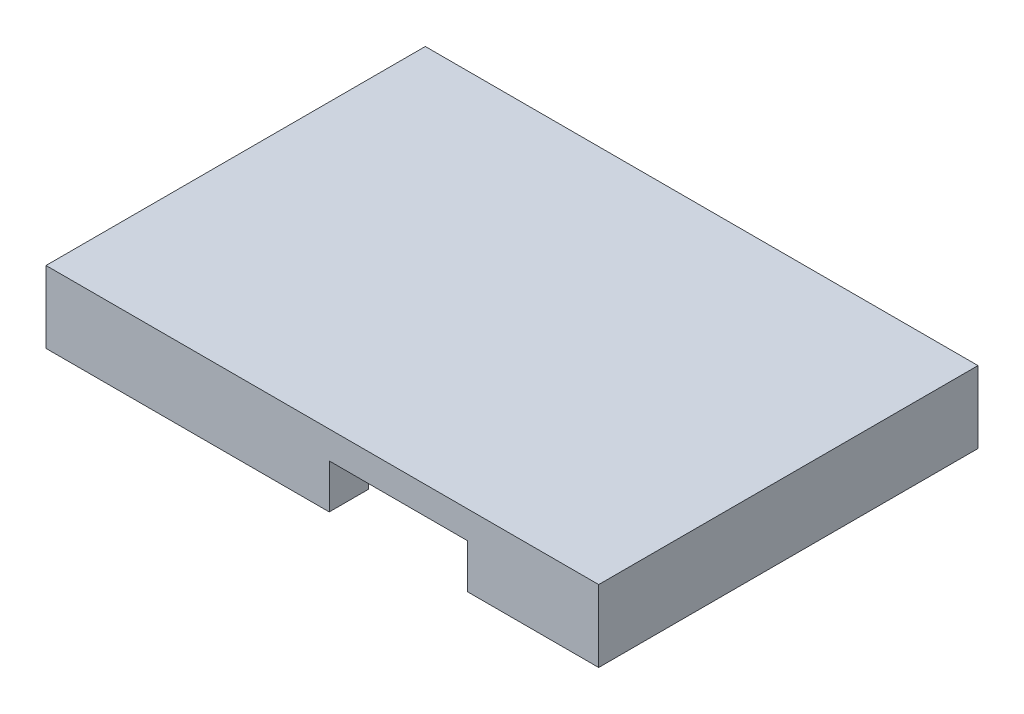
ISO-10303-21;
HEADER;
FILE_DESCRIPTION(('STEP AP214'),'2;1');
FILE_NAME('part.step','',(''),(''),'','','');
FILE_SCHEMA(('AUTOMOTIVE_DESIGN { 1 0 10303 214 1 1 1 1 }'));
ENDSEC;
DATA;
#1=APPLICATION_CONTEXT('core data for automotive mechanical design processes');
#2=APPLICATION_PROTOCOL_DEFINITION('international standard','automotive_design',2000,#1);
#3=PRODUCT_CONTEXT('',#1,'mechanical');
#4=PRODUCT('Part','Part','',(#3));
#5=PRODUCT_RELATED_PRODUCT_CATEGORY('part','',(#4));
#6=PRODUCT_DEFINITION_FORMATION('','',#4);
#7=PRODUCT_DEFINITION_CONTEXT('part definition',#1,'design');
#8=PRODUCT_DEFINITION('design','',#6,#7);
#9=PRODUCT_DEFINITION_SHAPE('','',#8);
#10=(LENGTH_UNIT() NAMED_UNIT(*) SI_UNIT(.MILLI.,.METRE.));
#11=(NAMED_UNIT(*) PLANE_ANGLE_UNIT() SI_UNIT($,.RADIAN.));
#12=(NAMED_UNIT(*) SI_UNIT($,.STERADIAN.) SOLID_ANGLE_UNIT());
#13=UNCERTAINTY_MEASURE_WITH_UNIT(LENGTH_MEASURE(1.E-05),#10,'distance_accuracy_value','');
#14=(GEOMETRIC_REPRESENTATION_CONTEXT(3) GLOBAL_UNCERTAINTY_ASSIGNED_CONTEXT((#13)) GLOBAL_UNIT_ASSIGNED_CONTEXT((#10,
#11,#12)) REPRESENTATION_CONTEXT('',''));
#15=CARTESIAN_POINT('',(0.,0.,0.));
#16=DIRECTION('',(0.,0.,1.));
#17=DIRECTION('',(1.,0.,0.));
#18=AXIS2_PLACEMENT_3D('',#15,#16,#17);
#19=CARTESIAN_POINT('',(11.5,3.2,10.8730401545976));
#20=DIRECTION('',(0.,0.,1.));
#21=DIRECTION('',(1.,0.,0.));
#22=AXIS2_PLACEMENT_3D('',#19,#20,#21);
#23=PLANE('',#22);
#24=DIRECTION('',(-1.,0.,0.));
#25=VECTOR('',#24,1.);
#26=CARTESIAN_POINT('',(11.5,0.,10.8730401545976));
#27=LINE('',#26,#25);
#28=CARTESIAN_POINT('',(11.5,0.,10.8730401545976));
#29=VERTEX_POINT('',#28);
#30=CARTESIAN_POINT('',(10.5,0.,10.8730401545976));
#31=VERTEX_POINT('',#30);
#32=EDGE_CURVE('E250',#29,#31,#27,.T.);
#33=ORIENTED_EDGE('',*,*,#32,.T.);
#34=DIRECTION('',(0.,-1.,0.));
#35=VECTOR('',#34,1.);
#36=CARTESIAN_POINT('',(10.5,3.2,10.8730401545976));
#37=LINE('',#36,#35);
#38=CARTESIAN_POINT('',(10.5,3.2,10.8730401545976));
#39=VERTEX_POINT('',#38);
#40=EDGE_CURVE('E12',#39,#31,#37,.T.);
#41=ORIENTED_EDGE('',*,*,#40,.F.);
#42=DIRECTION('',(-1.,0.,0.));
#43=VECTOR('',#42,1.);
#44=CARTESIAN_POINT('',(11.5,3.2,10.8730401545976));
#45=LINE('',#44,#43);
#46=CARTESIAN_POINT('',(11.5,3.2,10.8730401545976));
#47=VERTEX_POINT('',#46);
#48=EDGE_CURVE('E286',#47,#39,#45,.T.);
#49=ORIENTED_EDGE('',*,*,#48,.F.);
#50=DIRECTION('',(0.,-1.,0.));
#51=VECTOR('',#50,1.);
#52=CARTESIAN_POINT('',(11.5,3.2,10.8730401545976));
#53=LINE('',#52,#51);
#54=EDGE_CURVE('E246',#47,#29,#53,.T.);
#55=ORIENTED_EDGE('',*,*,#54,.T.);
#56=EDGE_LOOP('',(#33,#41,#49,#55));
#57=FACE_BOUND('',#56,.T.);
#58=ADVANCED_FACE('F76',(#57),#23,.F.);
#59=CARTESIAN_POINT('',(10.5,3.2,10.8730401545976));
#60=DIRECTION('',(1.,0.,0.));
#61=DIRECTION('',(0.,0.,-1.));
#62=AXIS2_PLACEMENT_3D('',#59,#60,#61);
#63=PLANE('',#62);
#64=DIRECTION('',(0.,0.,1.));
#65=VECTOR('',#64,1.);
#66=CARTESIAN_POINT('',(10.5,0.,10.8730401545976));
#67=LINE('',#66,#65);
#68=CARTESIAN_POINT('',(10.5,0.,13.7258729261331));
#69=VERTEX_POINT('',#68);
#70=EDGE_CURVE('E253',#31,#69,#67,.T.);
#71=ORIENTED_EDGE('',*,*,#70,.T.);
#72=DIRECTION('',(0.,-1.,0.));
#73=VECTOR('',#72,1.);
#74=CARTESIAN_POINT('',(10.5,3.2,13.7258729261331));
#75=LINE('',#74,#73);
#76=CARTESIAN_POINT('',(10.5,3.2,13.7258729261331));
#77=VERTEX_POINT('',#76);
#78=EDGE_CURVE('E87',#77,#69,#75,.T.);
#79=ORIENTED_EDGE('',*,*,#78,.F.);
#80=DIRECTION('',(0.,0.,1.));
#81=VECTOR('',#80,1.);
#82=CARTESIAN_POINT('',(10.5,3.2,10.8730401545976));
#83=LINE('',#82,#81);
#84=EDGE_CURVE('E174',#39,#77,#83,.T.);
#85=ORIENTED_EDGE('',*,*,#84,.F.);
#86=ORIENTED_EDGE('',*,*,#40,.T.);
#87=EDGE_LOOP('',(#71,#79,#85,#86));
#88=FACE_BOUND('',#87,.T.);
#89=ADVANCED_FACE('F401',(#88),#63,.F.);
#90=CARTESIAN_POINT('',(20.,3.2,13.7258729261331));
#91=DIRECTION('',(-1.,0.,0.));
#92=DIRECTION('',(0.,0.,1.));
#93=AXIS2_PLACEMENT_3D('',#90,#91,#92);
#94=PLANE('',#93);
#95=DIRECTION('',(0.,0.,-1.));
#96=VECTOR('',#95,1.);
#97=CARTESIAN_POINT('',(20.,0.,13.7258729261331));
#98=LINE('',#97,#96);
#99=CARTESIAN_POINT('',(20.,0.,13.7258729261331));
#100=VERTEX_POINT('',#99);
#101=CARTESIAN_POINT('',(20.,0.,-13.7258729261334));
#102=VERTEX_POINT('',#101);
#103=EDGE_CURVE('E258',#100,#102,#98,.T.);
#104=ORIENTED_EDGE('',*,*,#103,.T.);
#105=DIRECTION('',(0.,-1.,0.));
#106=VECTOR('',#105,1.);
#107=CARTESIAN_POINT('',(20.,3.2,-13.7258729261334));
#108=LINE('',#107,#106);
#109=CARTESIAN_POINT('',(20.,5.2,-13.7258729261334));
#110=VERTEX_POINT('',#109);
#111=EDGE_CURVE('E324',#110,#102,#108,.T.);
#112=ORIENTED_EDGE('',*,*,#111,.F.);
#113=DIRECTION('',(0.,0.,-1.));
#114=VECTOR('',#113,1.);
#115=CARTESIAN_POINT('',(20.,5.2,-13.7258729261334));
#116=LINE('',#115,#114);
#117=CARTESIAN_POINT('',(20.,5.2,13.7258729261331));
#118=VERTEX_POINT('',#117);
#119=EDGE_CURVE('E363',#118,#110,#116,.T.);
#120=ORIENTED_EDGE('',*,*,#119,.F.);
#121=DIRECTION('',(0.,-1.,0.));
#122=VECTOR('',#121,1.);
#123=CARTESIAN_POINT('',(20.,3.2,13.7258729261331));
#124=LINE('',#123,#122);
#125=EDGE_CURVE('E327',#118,#100,#124,.T.);
#126=ORIENTED_EDGE('',*,*,#125,.T.);
#127=EDGE_LOOP('',(#104,#112,#120,#126));
#128=FACE_BOUND('',#127,.T.);
#129=ADVANCED_FACE('F347',(#128),#94,.F.);
#130=CARTESIAN_POINT('',(20.,3.2,-13.7258729261334));
#131=DIRECTION('',(0.,0.,1.));
#132=DIRECTION('',(1.,0.,0.));
#133=AXIS2_PLACEMENT_3D('',#130,#131,#132);
#134=PLANE('',#133);
#135=DIRECTION('',(-1.,0.,0.));
#136=VECTOR('',#135,1.);
#137=CARTESIAN_POINT('',(20.,0.,-13.7258729261334));
#138=LINE('',#137,#136);
#139=CARTESIAN_POINT('',(-20.,0.,-13.7258729261334));
#140=VERTEX_POINT('',#139);
#141=EDGE_CURVE('E256',#102,#140,#138,.T.);
#142=ORIENTED_EDGE('',*,*,#141,.T.);
#143=DIRECTION('',(0.,-1.,0.));
#144=VECTOR('',#143,1.);
#145=CARTESIAN_POINT('',(-20.,3.2,-13.7258729261334));
#146=LINE('',#145,#144);
#147=CARTESIAN_POINT('',(-20.,5.2,-13.7258729261334));
#148=VERTEX_POINT('',#147);
#149=EDGE_CURVE('E325',#148,#140,#146,.T.);
#150=ORIENTED_EDGE('',*,*,#149,.F.);
#151=DIRECTION('',(-1.,0.,0.));
#152=VECTOR('',#151,1.);
#153=CARTESIAN_POINT('',(-20.,5.2,-13.7258729261334));
#154=LINE('',#153,#152);
#155=EDGE_CURVE('E252',#110,#148,#154,.T.);
#156=ORIENTED_EDGE('',*,*,#155,.F.);
#157=ORIENTED_EDGE('',*,*,#111,.T.);
#158=EDGE_LOOP('',(#142,#150,#156,#157));
#159=FACE_BOUND('',#158,.T.);
#160=ADVANCED_FACE('F355',(#159),#134,.F.);
#161=CARTESIAN_POINT('',(-20.,3.2,-13.7258729261334));
#162=DIRECTION('',(1.,0.,0.));
#163=DIRECTION('',(0.,0.,-1.));
#164=AXIS2_PLACEMENT_3D('',#161,#162,#163);
#165=PLANE('',#164);
#166=DIRECTION('',(0.,0.,1.));
#167=VECTOR('',#166,1.);
#168=CARTESIAN_POINT('',(-20.,0.,-13.7258729261334));
#169=LINE('',#168,#167);
#170=CARTESIAN_POINT('',(-20.,0.,13.7258729261331));
#171=VERTEX_POINT('',#170);
#172=EDGE_CURVE('E257',#140,#171,#169,.T.);
#173=ORIENTED_EDGE('',*,*,#172,.T.);
#174=DIRECTION('',(0.,-1.,0.));
#175=VECTOR('',#174,1.);
#176=CARTESIAN_POINT('',(-20.,3.2,13.7258729261331));
#177=LINE('',#176,#175);
#178=CARTESIAN_POINT('',(-20.,5.2,13.7258729261331));
#179=VERTEX_POINT('',#178);
#180=EDGE_CURVE('E317',#179,#171,#177,.T.);
#181=ORIENTED_EDGE('',*,*,#180,.F.);
#182=DIRECTION('',(0.,0.,1.));
#183=VECTOR('',#182,1.);
#184=CARTESIAN_POINT('',(-20.,5.2,-13.7258729261334));
#185=LINE('',#184,#183);
#186=EDGE_CURVE('E366',#148,#179,#185,.T.);
#187=ORIENTED_EDGE('',*,*,#186,.F.);
#188=ORIENTED_EDGE('',*,*,#149,.T.);
#189=EDGE_LOOP('',(#173,#181,#187,#188));
#190=FACE_BOUND('',#189,.T.);
#191=ADVANCED_FACE('F415',(#190),#165,.F.);
#192=CARTESIAN_POINT('',(-20.,3.2,13.7258729261331));
#193=DIRECTION('',(0.,0.,-1.));
#194=DIRECTION('',(-1.,0.,0.));
#195=AXIS2_PLACEMENT_3D('',#192,#193,#194);
#196=PLANE('',#195);
#197=DIRECTION('',(1.,0.,0.));
#198=VECTOR('',#197,1.);
#199=CARTESIAN_POINT('',(-20.,0.,13.7258729261331));
#200=LINE('',#199,#198);
#201=CARTESIAN_POINT('',(0.499999999999945,0.,13.7258729261331));
#202=VERTEX_POINT('',#201);
#203=EDGE_CURVE('E265',#171,#202,#200,.T.);
#204=ORIENTED_EDGE('',*,*,#203,.T.);
#205=DIRECTION('',(0.,-1.,0.));
#206=VECTOR('',#205,1.);
#207=CARTESIAN_POINT('',(0.499999999999945,3.2,13.7258729261331));
#208=LINE('',#207,#206);
#209=CARTESIAN_POINT('',(0.499999999999945,3.2,13.7258729261331));
#210=VERTEX_POINT('',#209);
#211=EDGE_CURVE('E316',#210,#202,#208,.T.);
#212=ORIENTED_EDGE('',*,*,#211,.F.);
#213=DIRECTION('',(1.,0.,0.));
#214=VECTOR('',#213,1.);
#215=CARTESIAN_POINT('',(-20.,3.2,13.7258729261331));
#216=LINE('',#215,#214);
#217=EDGE_CURVE('E340',#210,#77,#216,.T.);
#218=ORIENTED_EDGE('',*,*,#217,.T.);
#219=ORIENTED_EDGE('',*,*,#78,.T.);
#220=DIRECTION('',(1.,0.,0.));
#221=VECTOR('',#220,1.);
#222=CARTESIAN_POINT('',(10.5,0.,13.7258729261331));
#223=LINE('',#222,#221);
#224=EDGE_CURVE('E255',#69,#100,#223,.T.);
#225=ORIENTED_EDGE('',*,*,#224,.T.);
#226=ORIENTED_EDGE('',*,*,#125,.F.);
#227=DIRECTION('',(1.,0.,0.));
#228=VECTOR('',#227,1.);
#229=CARTESIAN_POINT('',(-20.,5.2,13.7258729261331));
#230=LINE('',#229,#228);
#231=EDGE_CURVE('E361',#179,#118,#230,.T.);
#232=ORIENTED_EDGE('',*,*,#231,.F.);
#233=ORIENTED_EDGE('',*,*,#180,.T.);
#234=EDGE_LOOP('',(#204,#212,#218,#219,#225,#226,#232,#233));
#235=FACE_BOUND('',#234,.T.);
#236=ADVANCED_FACE('F331',(#235),#196,.F.);
#237=CARTESIAN_POINT('',(0.499999999999945,3.2,13.7258729261331));
#238=DIRECTION('',(-1.,0.,0.));
#239=DIRECTION('',(0.,0.,1.));
#240=AXIS2_PLACEMENT_3D('',#237,#238,#239);
#241=PLANE('',#240);
#242=DIRECTION('',(0.,0.,-1.));
#243=VECTOR('',#242,1.);
#244=CARTESIAN_POINT('',(0.499999999999945,0.,13.7258729261331));
#245=LINE('',#244,#243);
#246=CARTESIAN_POINT('',(0.499999999999945,0.,10.8730401545976));
#247=VERTEX_POINT('',#246);
#248=EDGE_CURVE('E262',#202,#247,#245,.T.);
#249=ORIENTED_EDGE('',*,*,#248,.T.);
#250=DIRECTION('',(0.,-1.,0.));
#251=VECTOR('',#250,1.);
#252=CARTESIAN_POINT('',(0.499999999999945,3.2,10.8730401545976));
#253=LINE('',#252,#251);
#254=CARTESIAN_POINT('',(0.499999999999945,3.2,10.8730401545976));
#255=VERTEX_POINT('',#254);
#256=EDGE_CURVE('E311',#255,#247,#253,.T.);
#257=ORIENTED_EDGE('',*,*,#256,.F.);
#258=DIRECTION('',(0.,0.,-1.));
#259=VECTOR('',#258,1.);
#260=CARTESIAN_POINT('',(0.499999999999945,3.2,13.7258729261331));
#261=LINE('',#260,#259);
#262=EDGE_CURVE('E371',#210,#255,#261,.T.);
#263=ORIENTED_EDGE('',*,*,#262,.F.);
#264=ORIENTED_EDGE('',*,*,#211,.T.);
#265=EDGE_LOOP('',(#249,#257,#263,#264));
#266=FACE_BOUND('',#265,.T.);
#267=ADVANCED_FACE('F420',(#266),#241,.F.);
#268=CARTESIAN_POINT('',(0.499999999999945,3.2,10.8730401545976));
#269=DIRECTION('',(0.,0.,1.));
#270=DIRECTION('',(1.,0.,0.));
#271=AXIS2_PLACEMENT_3D('',#268,#269,#270);
#272=PLANE('',#271);
#273=DIRECTION('',(-1.,0.,0.));
#274=VECTOR('',#273,1.);
#275=CARTESIAN_POINT('',(0.499999999999945,0.,10.8730401545976));
#276=LINE('',#275,#274);
#277=CARTESIAN_POINT('',(-11.5,0.,10.8730401545976));
#278=VERTEX_POINT('',#277);
#279=EDGE_CURVE('E266',#247,#278,#276,.T.);
#280=ORIENTED_EDGE('',*,*,#279,.T.);
#281=DIRECTION('',(0.,-1.,0.));
#282=VECTOR('',#281,1.);
#283=CARTESIAN_POINT('',(-11.5,3.2,10.8730401545976));
#284=LINE('',#283,#282);
#285=CARTESIAN_POINT('',(-11.5,3.2,10.8730401545976));
#286=VERTEX_POINT('',#285);
#287=EDGE_CURVE('E309',#286,#278,#284,.T.);
#288=ORIENTED_EDGE('',*,*,#287,.F.);
#289=DIRECTION('',(-1.,0.,0.));
#290=VECTOR('',#289,1.);
#291=CARTESIAN_POINT('',(0.499999999999945,3.2,10.8730401545976));
#292=LINE('',#291,#290);
#293=EDGE_CURVE('E372',#255,#286,#292,.T.);
#294=ORIENTED_EDGE('',*,*,#293,.F.);
#295=ORIENTED_EDGE('',*,*,#256,.T.);
#296=EDGE_LOOP('',(#280,#288,#294,#295));
#297=FACE_BOUND('',#296,.T.);
#298=ADVANCED_FACE('F425',(#297),#272,.F.);
#299=CARTESIAN_POINT('',(-11.5,3.2,10.8730401545976));
#300=DIRECTION('',(-1.,0.,0.));
#301=DIRECTION('',(0.,0.,1.));
#302=AXIS2_PLACEMENT_3D('',#299,#300,#301);
#303=PLANE('',#302);
#304=DIRECTION('',(0.,0.,-1.));
#305=VECTOR('',#304,1.);
#306=CARTESIAN_POINT('',(-11.5,0.,10.8730401545976));
#307=LINE('',#306,#305);
#308=CARTESIAN_POINT('',(-11.5,0.,6.87304015459755));
#309=VERTEX_POINT('',#308);
#310=EDGE_CURVE('E268',#278,#309,#307,.T.);
#311=ORIENTED_EDGE('',*,*,#310,.T.);
#312=DIRECTION('',(0.,-1.,0.));
#313=VECTOR('',#312,1.);
#314=CARTESIAN_POINT('',(-11.5,3.2,6.87304015459755));
#315=LINE('',#314,#313);
#316=CARTESIAN_POINT('',(-11.5,3.2,6.87304015459755));
#317=VERTEX_POINT('',#316);
#318=EDGE_CURVE('E307',#317,#309,#315,.T.);
#319=ORIENTED_EDGE('',*,*,#318,.F.);
#320=DIRECTION('',(0.,0.,-1.));
#321=VECTOR('',#320,1.);
#322=CARTESIAN_POINT('',(-11.5,3.2,10.8730401545976));
#323=LINE('',#322,#321);
#324=EDGE_CURVE('E380',#286,#317,#323,.T.);
#325=ORIENTED_EDGE('',*,*,#324,.F.);
#326=ORIENTED_EDGE('',*,*,#287,.T.);
#327=EDGE_LOOP('',(#311,#319,#325,#326));
#328=FACE_BOUND('',#327,.T.);
#329=ADVANCED_FACE('F426',(#328),#303,.F.);
#330=CARTESIAN_POINT('',(-11.5,3.2,6.87304015459755));
#331=DIRECTION('',(0.,0.,1.));
#332=DIRECTION('',(1.,0.,0.));
#333=AXIS2_PLACEMENT_3D('',#330,#331,#332);
#334=PLANE('',#333);
#335=DIRECTION('',(-1.,0.,0.));
#336=VECTOR('',#335,1.);
#337=CARTESIAN_POINT('',(-11.5,0.,6.87304015459755));
#338=LINE('',#337,#336);
#339=CARTESIAN_POINT('',(-16.,0.,6.87304015459755));
#340=VERTEX_POINT('',#339);
#341=EDGE_CURVE('E269',#309,#340,#338,.T.);
#342=ORIENTED_EDGE('',*,*,#341,.T.);
#343=DIRECTION('',(0.,-1.,0.));
#344=VECTOR('',#343,1.);
#345=CARTESIAN_POINT('',(-16.,3.2,6.87304015459755));
#346=LINE('',#345,#344);
#347=CARTESIAN_POINT('',(-16.,3.2,6.87304015459755));
#348=VERTEX_POINT('',#347);
#349=EDGE_CURVE('E303',#348,#340,#346,.T.);
#350=ORIENTED_EDGE('',*,*,#349,.F.);
#351=DIRECTION('',(-1.,0.,0.));
#352=VECTOR('',#351,1.);
#353=CARTESIAN_POINT('',(-11.5,3.2,6.87304015459755));
#354=LINE('',#353,#352);
#355=EDGE_CURVE('E379',#317,#348,#354,.T.);
#356=ORIENTED_EDGE('',*,*,#355,.F.);
#357=ORIENTED_EDGE('',*,*,#318,.T.);
#358=EDGE_LOOP('',(#342,#350,#356,#357));
#359=FACE_BOUND('',#358,.T.);
#360=ADVANCED_FACE('F429',(#359),#334,.F.);
#361=CARTESIAN_POINT('',(-16.,3.2,6.87304015459755));
#362=DIRECTION('',(-1.,0.,0.));
#363=DIRECTION('',(0.,0.,1.));
#364=AXIS2_PLACEMENT_3D('',#361,#362,#363);
#365=PLANE('',#364);
#366=DIRECTION('',(0.,0.,-1.));
#367=VECTOR('',#366,1.);
#368=CARTESIAN_POINT('',(-16.,0.,6.87304015459755));
#369=LINE('',#368,#367);
#370=CARTESIAN_POINT('',(-16.,0.,4.87304015459755));
#371=VERTEX_POINT('',#370);
#372=EDGE_CURVE('E275',#340,#371,#369,.T.);
#373=ORIENTED_EDGE('',*,*,#372,.T.);
#374=DIRECTION('',(0.,-1.,0.));
#375=VECTOR('',#374,1.);
#376=CARTESIAN_POINT('',(-16.,3.2,4.87304015459755));
#377=LINE('',#376,#375);
#378=CARTESIAN_POINT('',(-16.,3.2,4.87304015459755));
#379=VERTEX_POINT('',#378);
#380=EDGE_CURVE('E304',#379,#371,#377,.T.);
#381=ORIENTED_EDGE('',*,*,#380,.F.);
#382=DIRECTION('',(0.,0.,-1.));
#383=VECTOR('',#382,1.);
#384=CARTESIAN_POINT('',(-16.,3.2,6.87304015459755));
#385=LINE('',#384,#383);
#386=EDGE_CURVE('E382',#348,#379,#385,.T.);
#387=ORIENTED_EDGE('',*,*,#386,.F.);
#388=ORIENTED_EDGE('',*,*,#349,.T.);
#389=EDGE_LOOP('',(#373,#381,#387,#388));
#390=FACE_BOUND('',#389,.T.);
#391=ADVANCED_FACE('F432',(#390),#365,.F.);
#392=CARTESIAN_POINT('',(-16.,3.2,4.87304015459755));
#393=DIRECTION('',(0.,0.,-1.));
#394=DIRECTION('',(-1.,0.,0.));
#395=AXIS2_PLACEMENT_3D('',#392,#393,#394);
#396=PLANE('',#395);
#397=DIRECTION('',(1.,0.,0.));
#398=VECTOR('',#397,1.);
#399=CARTESIAN_POINT('',(-16.,0.,4.87304015459755));
#400=LINE('',#399,#398);
#401=CARTESIAN_POINT('',(-11.5,0.,4.87304015459755));
#402=VERTEX_POINT('',#401);
#403=EDGE_CURVE('E273',#371,#402,#400,.T.);
#404=ORIENTED_EDGE('',*,*,#403,.T.);
#405=DIRECTION('',(0.,-1.,0.));
#406=VECTOR('',#405,1.);
#407=CARTESIAN_POINT('',(-11.5,3.2,4.87304015459755));
#408=LINE('',#407,#406);
#409=CARTESIAN_POINT('',(-11.5,3.2,4.87304015459755));
#410=VERTEX_POINT('',#409);
#411=EDGE_CURVE('E299',#410,#402,#408,.T.);
#412=ORIENTED_EDGE('',*,*,#411,.F.);
#413=DIRECTION('',(1.,0.,0.));
#414=VECTOR('',#413,1.);
#415=CARTESIAN_POINT('',(-16.,3.2,4.87304015459755));
#416=LINE('',#415,#414);
#417=EDGE_CURVE('E387',#379,#410,#416,.T.);
#418=ORIENTED_EDGE('',*,*,#417,.F.);
#419=ORIENTED_EDGE('',*,*,#380,.T.);
#420=EDGE_LOOP('',(#404,#412,#418,#419));
#421=FACE_BOUND('',#420,.T.);
#422=ADVANCED_FACE('F437',(#421),#396,.F.);
#423=CARTESIAN_POINT('',(-11.5,3.2,4.87304015459755));
#424=DIRECTION('',(-1.,0.,0.));
#425=DIRECTION('',(0.,0.,1.));
#426=AXIS2_PLACEMENT_3D('',#423,#424,#425);
#427=PLANE('',#426);
#428=DIRECTION('',(0.,0.,-1.));
#429=VECTOR('',#428,1.);
#430=CARTESIAN_POINT('',(-11.5,0.,4.87304015459755));
#431=LINE('',#430,#429);
#432=CARTESIAN_POINT('',(-11.5,0.,-10.6269598454023));
#433=VERTEX_POINT('',#432);
#434=EDGE_CURVE('E277',#402,#433,#431,.T.);
#435=ORIENTED_EDGE('',*,*,#434,.T.);
#436=DIRECTION('',(0.,-1.,0.));
#437=VECTOR('',#436,1.);
#438=CARTESIAN_POINT('',(-11.5,3.2,-10.6269598454023));
#439=LINE('',#438,#437);
#440=CARTESIAN_POINT('',(-11.5,3.2,-10.6269598454023));
#441=VERTEX_POINT('',#440);
#442=EDGE_CURVE('E293',#441,#433,#439,.T.);
#443=ORIENTED_EDGE('',*,*,#442,.F.);
#444=DIRECTION('',(0.,0.,-1.));
#445=VECTOR('',#444,1.);
#446=CARTESIAN_POINT('',(-11.5,3.2,4.87304015459755));
#447=LINE('',#446,#445);
#448=EDGE_CURVE('E386',#410,#441,#447,.T.);
#449=ORIENTED_EDGE('',*,*,#448,.F.);
#450=ORIENTED_EDGE('',*,*,#411,.T.);
#451=EDGE_LOOP('',(#435,#443,#449,#450));
#452=FACE_BOUND('',#451,.T.);
#453=ADVANCED_FACE('F445',(#452),#427,.F.);
#454=CARTESIAN_POINT('',(-11.5,3.2,-10.6269598454023));
#455=DIRECTION('',(0.,0.,-1.));
#456=DIRECTION('',(-1.,0.,0.));
#457=AXIS2_PLACEMENT_3D('',#454,#455,#456);
#458=PLANE('',#457);
#459=DIRECTION('',(1.,0.,0.));
#460=VECTOR('',#459,1.);
#461=CARTESIAN_POINT('',(-11.5,0.,-10.6269598454023));
#462=LINE('',#461,#460);
#463=CARTESIAN_POINT('',(11.5,0.,-10.6269598454023));
#464=VERTEX_POINT('',#463);
#465=EDGE_CURVE('E279',#433,#464,#462,.T.);
#466=ORIENTED_EDGE('',*,*,#465,.T.);
#467=DIRECTION('',(0.,-1.,0.));
#468=VECTOR('',#467,1.);
#469=CARTESIAN_POINT('',(11.5,3.2,-10.6269598454023));
#470=LINE('',#469,#468);
#471=CARTESIAN_POINT('',(11.5,3.2,-10.6269598454023));
#472=VERTEX_POINT('',#471);
#473=EDGE_CURVE('E295',#472,#464,#470,.T.);
#474=ORIENTED_EDGE('',*,*,#473,.F.);
#475=DIRECTION('',(1.,0.,0.));
#476=VECTOR('',#475,1.);
#477=CARTESIAN_POINT('',(-11.5,3.2,-10.6269598454023));
#478=LINE('',#477,#476);
#479=EDGE_CURVE('E239',#441,#472,#478,.T.);
#480=ORIENTED_EDGE('',*,*,#479,.F.);
#481=ORIENTED_EDGE('',*,*,#442,.T.);
#482=EDGE_LOOP('',(#466,#474,#480,#481));
#483=FACE_BOUND('',#482,.T.);
#484=ADVANCED_FACE('F391',(#483),#458,.F.);
#485=CARTESIAN_POINT('',(11.5,3.2,-10.6269598454023));
#486=DIRECTION('',(1.,0.,0.));
#487=DIRECTION('',(0.,0.,-1.));
#488=AXIS2_PLACEMENT_3D('',#485,#486,#487);
#489=PLANE('',#488);
#490=DIRECTION('',(0.,0.,1.));
#491=VECTOR('',#490,1.);
#492=CARTESIAN_POINT('',(11.5,0.,-10.6269598454023));
#493=LINE('',#492,#491);
#494=CARTESIAN_POINT('',(11.5,0.,4.87304015459755));
#495=VERTEX_POINT('',#494);
#496=EDGE_CURVE('E278',#464,#495,#493,.T.);
#497=ORIENTED_EDGE('',*,*,#496,.T.);
#498=DIRECTION('',(0.,-1.,0.));
#499=VECTOR('',#498,1.);
#500=CARTESIAN_POINT('',(11.5,3.2,4.87304015459755));
#501=LINE('',#500,#499);
#502=CARTESIAN_POINT('',(11.5,3.2,4.87304015459755));
#503=VERTEX_POINT('',#502);
#504=EDGE_CURVE('E224',#503,#495,#501,.T.);
#505=ORIENTED_EDGE('',*,*,#504,.F.);
#506=DIRECTION('',(0.,0.,1.));
#507=VECTOR('',#506,1.);
#508=CARTESIAN_POINT('',(11.5,3.2,-10.6269598454023));
#509=LINE('',#508,#507);
#510=EDGE_CURVE('E240',#472,#503,#509,.T.);
#511=ORIENTED_EDGE('',*,*,#510,.F.);
#512=ORIENTED_EDGE('',*,*,#473,.T.);
#513=EDGE_LOOP('',(#497,#505,#511,#512));
#514=FACE_BOUND('',#513,.T.);
#515=ADVANCED_FACE('F400',(#514),#489,.F.);
#516=CARTESIAN_POINT('',(11.5,3.2,4.87304015459755));
#517=DIRECTION('',(0.,0.,-1.));
#518=DIRECTION('',(-1.,0.,0.));
#519=AXIS2_PLACEMENT_3D('',#516,#517,#518);
#520=PLANE('',#519);
#521=DIRECTION('',(1.,0.,0.));
#522=VECTOR('',#521,1.);
#523=CARTESIAN_POINT('',(11.5,0.,4.87304015459755));
#524=LINE('',#523,#522);
#525=CARTESIAN_POINT('',(16.,0.,4.87304015459755));
#526=VERTEX_POINT('',#525);
#527=EDGE_CURVE('E219',#495,#526,#524,.T.);
#528=ORIENTED_EDGE('',*,*,#527,.T.);
#529=DIRECTION('',(0.,-1.,0.));
#530=VECTOR('',#529,1.);
#531=CARTESIAN_POINT('',(16.,3.2,4.87304015459755));
#532=LINE('',#531,#530);
#533=CARTESIAN_POINT('',(16.,3.2,4.87304015459755));
#534=VERTEX_POINT('',#533);
#535=EDGE_CURVE('E215',#534,#526,#532,.T.);
#536=ORIENTED_EDGE('',*,*,#535,.F.);
#537=DIRECTION('',(1.,0.,0.));
#538=VECTOR('',#537,1.);
#539=CARTESIAN_POINT('',(11.5,3.2,4.87304015459755));
#540=LINE('',#539,#538);
#541=EDGE_CURVE('E220',#503,#534,#540,.T.);
#542=ORIENTED_EDGE('',*,*,#541,.F.);
#543=ORIENTED_EDGE('',*,*,#504,.T.);
#544=EDGE_LOOP('',(#528,#536,#542,#543));
#545=FACE_BOUND('',#544,.T.);
#546=ADVANCED_FACE('F212',(#545),#520,.F.);
#547=CARTESIAN_POINT('',(16.,3.2,4.87304015459755));
#548=DIRECTION('',(1.,0.,0.));
#549=DIRECTION('',(0.,0.,-1.));
#550=AXIS2_PLACEMENT_3D('',#547,#548,#549);
#551=PLANE('',#550);
#552=DIRECTION('',(0.,0.,1.));
#553=VECTOR('',#552,1.);
#554=CARTESIAN_POINT('',(16.,0.,4.87304015459755));
#555=LINE('',#554,#553);
#556=CARTESIAN_POINT('',(16.,0.,6.87304015459755));
#557=VERTEX_POINT('',#556);
#558=EDGE_CURVE('E284',#526,#557,#555,.T.);
#559=ORIENTED_EDGE('',*,*,#558,.T.);
#560=DIRECTION('',(0.,-1.,0.));
#561=VECTOR('',#560,1.);
#562=CARTESIAN_POINT('',(16.,3.2,6.87304015459755));
#563=LINE('',#562,#561);
#564=CARTESIAN_POINT('',(16.,3.2,6.87304015459755));
#565=VERTEX_POINT('',#564);
#566=EDGE_CURVE('E221',#565,#557,#563,.T.);
#567=ORIENTED_EDGE('',*,*,#566,.F.);
#568=DIRECTION('',(0.,0.,1.));
#569=VECTOR('',#568,1.);
#570=CARTESIAN_POINT('',(16.,3.2,4.87304015459755));
#571=LINE('',#570,#569);
#572=EDGE_CURVE('E230',#534,#565,#571,.T.);
#573=ORIENTED_EDGE('',*,*,#572,.F.);
#574=ORIENTED_EDGE('',*,*,#535,.T.);
#575=EDGE_LOOP('',(#559,#567,#573,#574));
#576=FACE_BOUND('',#575,.T.);
#577=ADVANCED_FACE('F229',(#576),#551,.F.);
#578=CARTESIAN_POINT('',(16.,3.2,6.87304015459755));
#579=DIRECTION('',(0.,0.,1.));
#580=DIRECTION('',(1.,0.,0.));
#581=AXIS2_PLACEMENT_3D('',#578,#579,#580);
#582=PLANE('',#581);
#583=DIRECTION('',(-1.,0.,0.));
#584=VECTOR('',#583,1.);
#585=CARTESIAN_POINT('',(16.,0.,6.87304015459755));
#586=LINE('',#585,#584);
#587=CARTESIAN_POINT('',(11.5,0.,6.87304015459755));
#588=VERTEX_POINT('',#587);
#589=EDGE_CURVE('E157',#557,#588,#586,.T.);
#590=ORIENTED_EDGE('',*,*,#589,.T.);
#591=DIRECTION('',(0.,-1.,0.));
#592=VECTOR('',#591,1.);
#593=CARTESIAN_POINT('',(11.5,3.2,6.87304015459755));
#594=LINE('',#593,#592);
#595=CARTESIAN_POINT('',(11.5,3.2,6.87304015459755));
#596=VERTEX_POINT('',#595);
#597=EDGE_CURVE('E92',#596,#588,#594,.T.);
#598=ORIENTED_EDGE('',*,*,#597,.F.);
#599=DIRECTION('',(-1.,0.,0.));
#600=VECTOR('',#599,1.);
#601=CARTESIAN_POINT('',(16.,3.2,6.87304015459755));
#602=LINE('',#601,#600);
#603=EDGE_CURVE('E234',#565,#596,#602,.T.);
#604=ORIENTED_EDGE('',*,*,#603,.F.);
#605=ORIENTED_EDGE('',*,*,#566,.T.);
#606=EDGE_LOOP('',(#590,#598,#604,#605));
#607=FACE_BOUND('',#606,.T.);
#608=ADVANCED_FACE('F398',(#607),#582,.F.);
#609=CARTESIAN_POINT('',(11.5,3.2,6.87304015459755));
#610=DIRECTION('',(1.,0.,0.));
#611=DIRECTION('',(0.,0.,-1.));
#612=AXIS2_PLACEMENT_3D('',#609,#610,#611);
#613=PLANE('',#612);
#614=DIRECTION('',(0.,0.,1.));
#615=VECTOR('',#614,1.);
#616=CARTESIAN_POINT('',(11.5,0.,6.87304015459755));
#617=LINE('',#616,#615);
#618=EDGE_CURVE('E164',#588,#29,#617,.T.);
#619=ORIENTED_EDGE('',*,*,#618,.T.);
#620=ORIENTED_EDGE('',*,*,#54,.F.);
#621=DIRECTION('',(0.,0.,1.));
#622=VECTOR('',#621,1.);
#623=CARTESIAN_POINT('',(11.5,3.2,6.87304015459755));
#624=LINE('',#623,#622);
#625=EDGE_CURVE('E241',#596,#47,#624,.T.);
#626=ORIENTED_EDGE('',*,*,#625,.F.);
#627=ORIENTED_EDGE('',*,*,#597,.T.);
#628=EDGE_LOOP('',(#619,#620,#626,#627));
#629=FACE_BOUND('',#628,.T.);
#630=ADVANCED_FACE('F402',(#629),#613,.F.);
#631=CARTESIAN_POINT('',(0.,0.,0.));
#632=DIRECTION('',(0.,1.,0.));
#633=DIRECTION('',(0.,0.,1.));
#634=AXIS2_PLACEMENT_3D('',#631,#632,#633);
#635=PLANE('',#634);
#636=ORIENTED_EDGE('',*,*,#32,.F.);
#637=ORIENTED_EDGE('',*,*,#618,.F.);
#638=ORIENTED_EDGE('',*,*,#589,.F.);
#639=ORIENTED_EDGE('',*,*,#558,.F.);
#640=ORIENTED_EDGE('',*,*,#527,.F.);
#641=ORIENTED_EDGE('',*,*,#496,.F.);
#642=ORIENTED_EDGE('',*,*,#465,.F.);
#643=ORIENTED_EDGE('',*,*,#434,.F.);
#644=ORIENTED_EDGE('',*,*,#403,.F.);
#645=ORIENTED_EDGE('',*,*,#372,.F.);
#646=ORIENTED_EDGE('',*,*,#341,.F.);
#647=ORIENTED_EDGE('',*,*,#310,.F.);
#648=ORIENTED_EDGE('',*,*,#279,.F.);
#649=ORIENTED_EDGE('',*,*,#248,.F.);
#650=ORIENTED_EDGE('',*,*,#203,.F.);
#651=ORIENTED_EDGE('',*,*,#172,.F.);
#652=ORIENTED_EDGE('',*,*,#141,.F.);
#653=ORIENTED_EDGE('',*,*,#103,.F.);
#654=ORIENTED_EDGE('',*,*,#224,.F.);
#655=ORIENTED_EDGE('',*,*,#70,.F.);
#656=EDGE_LOOP('',(#636,#637,#638,#639,#640,#641,#642,#643,#644,#645,#646,#647,#648,#649,#650,
#651,#652,#653,#654,#655));
#657=FACE_BOUND('',#656,.T.);
#658=ADVANCED_FACE('F344',(#657),#635,.F.);
#659=CARTESIAN_POINT('',(0.,3.2,0.));
#660=DIRECTION('',(0.,1.,0.));
#661=DIRECTION('',(0.,0.,1.));
#662=AXIS2_PLACEMENT_3D('',#659,#660,#661);
#663=PLANE('',#662);
#664=ORIENTED_EDGE('',*,*,#48,.T.);
#665=ORIENTED_EDGE('',*,*,#84,.T.);
#666=ORIENTED_EDGE('',*,*,#217,.F.);
#667=ORIENTED_EDGE('',*,*,#262,.T.);
#668=ORIENTED_EDGE('',*,*,#293,.T.);
#669=ORIENTED_EDGE('',*,*,#324,.T.);
#670=ORIENTED_EDGE('',*,*,#355,.T.);
#671=ORIENTED_EDGE('',*,*,#386,.T.);
#672=ORIENTED_EDGE('',*,*,#417,.T.);
#673=ORIENTED_EDGE('',*,*,#448,.T.);
#674=ORIENTED_EDGE('',*,*,#479,.T.);
#675=ORIENTED_EDGE('',*,*,#510,.T.);
#676=ORIENTED_EDGE('',*,*,#541,.T.);
#677=ORIENTED_EDGE('',*,*,#572,.T.);
#678=ORIENTED_EDGE('',*,*,#603,.T.);
#679=ORIENTED_EDGE('',*,*,#625,.T.);
#680=EDGE_LOOP('',(#664,#665,#666,#667,#668,#669,#670,#671,#672,#673,#674,#675,#676,#677,#678,#679));
#681=FACE_BOUND('',#680,.T.);
#682=ADVANCED_FACE('F233',(#681),#663,.F.);
#683=CARTESIAN_POINT('',(0.,5.2,0.));
#684=DIRECTION('',(0.,1.,0.));
#685=DIRECTION('',(0.,0.,1.));
#686=AXIS2_PLACEMENT_3D('',#683,#684,#685);
#687=PLANE('',#686);
#688=ORIENTED_EDGE('',*,*,#186,.T.);
#689=ORIENTED_EDGE('',*,*,#231,.T.);
#690=ORIENTED_EDGE('',*,*,#119,.T.);
#691=ORIENTED_EDGE('',*,*,#155,.T.);
#692=EDGE_LOOP('',(#688,#689,#690,#691));
#693=FACE_BOUND('',#692,.T.);
#694=ADVANCED_FACE('F464',(#693),#687,.T.);
#695=CLOSED_SHELL('',(#58,#89,#129,#160,#191,#236,#267,#298,#329,#360,#391,#422,#453,#484,#515,
#546,#577,#608,#630,#658,#682,#694));
#696=MANIFOLD_SOLID_BREP('B2',#695);
#697=ADVANCED_BREP_SHAPE_REPRESENTATION('',(#18,#696),#14);
#698=SHAPE_DEFINITION_REPRESENTATION(#9,#697);
ENDSEC;
END-ISO-10303-21;
